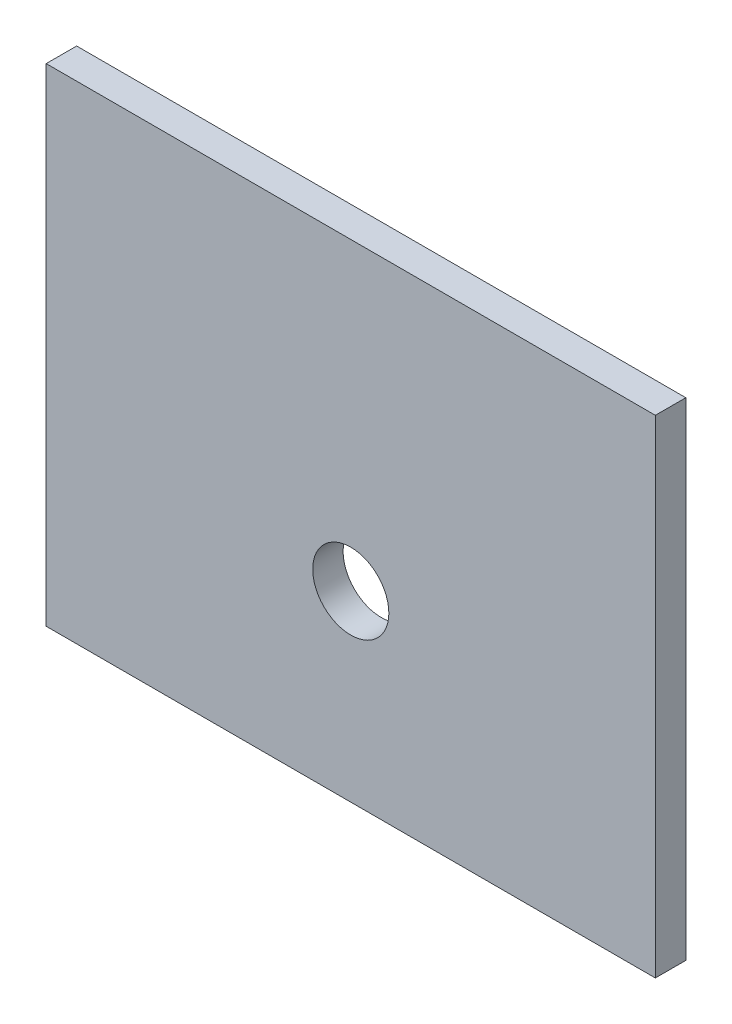
ISO-10303-21;
HEADER;
FILE_DESCRIPTION(('STEP AP214'),'2;1');
FILE_NAME('part.step','',(''),(''),'','','');
FILE_SCHEMA(('AUTOMOTIVE_DESIGN { 1 0 10303 214 1 1 1 1 }'));
ENDSEC;
DATA;
#1=APPLICATION_CONTEXT('core data for automotive mechanical design processes');
#2=APPLICATION_PROTOCOL_DEFINITION('international standard','automotive_design',2000,#1);
#3=PRODUCT_CONTEXT('',#1,'mechanical');
#4=PRODUCT('Part','Part','',(#3));
#5=PRODUCT_RELATED_PRODUCT_CATEGORY('part','',(#4));
#6=PRODUCT_DEFINITION_FORMATION('','',#4);
#7=PRODUCT_DEFINITION_CONTEXT('part definition',#1,'design');
#8=PRODUCT_DEFINITION('design','',#6,#7);
#9=PRODUCT_DEFINITION_SHAPE('','',#8);
#10=(LENGTH_UNIT() NAMED_UNIT(*) SI_UNIT(.MILLI.,.METRE.));
#11=(NAMED_UNIT(*) PLANE_ANGLE_UNIT() SI_UNIT($,.RADIAN.));
#12=(NAMED_UNIT(*) SI_UNIT($,.STERADIAN.) SOLID_ANGLE_UNIT());
#13=UNCERTAINTY_MEASURE_WITH_UNIT(LENGTH_MEASURE(1.E-05),#10,'distance_accuracy_value','');
#14=(GEOMETRIC_REPRESENTATION_CONTEXT(3) GLOBAL_UNCERTAINTY_ASSIGNED_CONTEXT((#13)) GLOBAL_UNIT_ASSIGNED_CONTEXT((#10,
#11,#12)) REPRESENTATION_CONTEXT('',''));
#15=CARTESIAN_POINT('',(0.,0.,0.));
#16=DIRECTION('',(0.,0.,1.));
#17=DIRECTION('',(1.,0.,0.));
#18=AXIS2_PLACEMENT_3D('',#15,#16,#17);
#19=CARTESIAN_POINT('',(0.,0.,3.175));
#20=DIRECTION('',(0.,0.,1.));
#21=DIRECTION('',(1.,0.,0.));
#22=AXIS2_PLACEMENT_3D('',#19,#20,#21);
#23=PLANE('',#22);
#24=DIRECTION('',(0.,1.,0.));
#25=VECTOR('',#24,1.);
#26=CARTESIAN_POINT('',(31.75,25.4,3.175));
#27=LINE('',#26,#25);
#28=CARTESIAN_POINT('',(31.75,-25.4,3.175));
#29=VERTEX_POINT('',#28);
#30=CARTESIAN_POINT('',(31.75,25.4,3.175));
#31=VERTEX_POINT('',#30);
#32=EDGE_CURVE('E84',#29,#31,#27,.T.);
#33=ORIENTED_EDGE('',*,*,#32,.T.);
#34=DIRECTION('',(-1.,0.,0.));
#35=VECTOR('',#34,1.);
#36=CARTESIAN_POINT('',(-31.75,25.4,3.175));
#37=LINE('',#36,#35);
#38=CARTESIAN_POINT('',(-31.75,25.4,3.175));
#39=VERTEX_POINT('',#38);
#40=EDGE_CURVE('E79',#31,#39,#37,.T.);
#41=ORIENTED_EDGE('',*,*,#40,.T.);
#42=DIRECTION('',(0.,-1.,0.));
#43=VECTOR('',#42,1.);
#44=CARTESIAN_POINT('',(-31.75,25.4,3.175));
#45=LINE('',#44,#43);
#46=CARTESIAN_POINT('',(-31.75,-25.4,3.175));
#47=VERTEX_POINT('',#46);
#48=EDGE_CURVE('E82',#39,#47,#45,.T.);
#49=ORIENTED_EDGE('',*,*,#48,.T.);
#50=DIRECTION('',(1.,0.,0.));
#51=VECTOR('',#50,1.);
#52=CARTESIAN_POINT('',(-31.75,-25.4,3.175));
#53=LINE('',#52,#51);
#54=EDGE_CURVE('E49',#47,#29,#53,.T.);
#55=ORIENTED_EDGE('',*,*,#54,.T.);
#56=EDGE_LOOP('',(#33,#41,#49,#55));
#57=FACE_BOUND('',#56,.T.);
#58=CARTESIAN_POINT('',(0.,-6.35,3.175));
#59=DIRECTION('',(0.,0.,1.));
#60=DIRECTION('',(1.,0.,0.));
#61=AXIS2_PLACEMENT_3D('',#58,#59,#60);
#62=CIRCLE('',#61,3.96875);
#63=CARTESIAN_POINT('',(3.96875,-6.35,3.175));
#64=VERTEX_POINT('',#63);
#65=EDGE_CURVE('E99',#64,#64,#62,.T.);
#66=ORIENTED_EDGE('',*,*,#65,.F.);
#67=EDGE_LOOP('',(#66));
#68=FACE_BOUND('',#67,.T.);
#69=ADVANCED_FACE('F32',(#57,#68),#23,.T.);
#70=CARTESIAN_POINT('',(0.,0.,0.));
#71=DIRECTION('',(0.,0.,1.));
#72=DIRECTION('',(1.,0.,0.));
#73=AXIS2_PLACEMENT_3D('',#70,#71,#72);
#74=PLANE('',#73);
#75=DIRECTION('',(0.,1.,0.));
#76=VECTOR('',#75,1.);
#77=CARTESIAN_POINT('',(31.75,25.4,0.));
#78=LINE('',#77,#76);
#79=CARTESIAN_POINT('',(31.75,-25.4,0.));
#80=VERTEX_POINT('',#79);
#81=CARTESIAN_POINT('',(31.75,25.4,0.));
#82=VERTEX_POINT('',#81);
#83=EDGE_CURVE('E96',#80,#82,#78,.T.);
#84=ORIENTED_EDGE('',*,*,#83,.F.);
#85=DIRECTION('',(1.,0.,0.));
#86=VECTOR('',#85,1.);
#87=CARTESIAN_POINT('',(-31.75,-25.4,0.));
#88=LINE('',#87,#86);
#89=CARTESIAN_POINT('',(-31.75,-25.4,0.));
#90=VERTEX_POINT('',#89);
#91=EDGE_CURVE('E72',#90,#80,#88,.T.);
#92=ORIENTED_EDGE('',*,*,#91,.F.);
#93=DIRECTION('',(0.,-1.,0.));
#94=VECTOR('',#93,1.);
#95=CARTESIAN_POINT('',(-31.75,25.4,0.));
#96=LINE('',#95,#94);
#97=CARTESIAN_POINT('',(-31.75,25.4,0.));
#98=VERTEX_POINT('',#97);
#99=EDGE_CURVE('E66',#98,#90,#96,.T.);
#100=ORIENTED_EDGE('',*,*,#99,.F.);
#101=DIRECTION('',(-1.,0.,0.));
#102=VECTOR('',#101,1.);
#103=CARTESIAN_POINT('',(-31.75,25.4,0.));
#104=LINE('',#103,#102);
#105=EDGE_CURVE('E88',#82,#98,#104,.T.);
#106=ORIENTED_EDGE('',*,*,#105,.F.);
#107=EDGE_LOOP('',(#84,#92,#100,#106));
#108=FACE_BOUND('',#107,.T.);
#109=CARTESIAN_POINT('',(0.,-6.35,0.));
#110=DIRECTION('',(0.,0.,1.));
#111=DIRECTION('',(1.,0.,0.));
#112=AXIS2_PLACEMENT_3D('',#109,#110,#111);
#113=CIRCLE('',#112,3.96875);
#114=CARTESIAN_POINT('',(3.96875,-6.35,0.));
#115=VERTEX_POINT('',#114);
#116=EDGE_CURVE('E111',#115,#115,#113,.T.);
#117=ORIENTED_EDGE('',*,*,#116,.T.);
#118=EDGE_LOOP('',(#117));
#119=FACE_BOUND('',#118,.T.);
#120=ADVANCED_FACE('F107',(#108,#119),#74,.F.);
#121=CARTESIAN_POINT('',(31.75,25.4,3.175));
#122=DIRECTION('',(-1.,0.,0.));
#123=DIRECTION('',(0.,0.,1.));
#124=AXIS2_PLACEMENT_3D('',#121,#122,#123);
#125=PLANE('',#124);
#126=ORIENTED_EDGE('',*,*,#83,.T.);
#127=DIRECTION('',(0.,0.,-1.));
#128=VECTOR('',#127,1.);
#129=CARTESIAN_POINT('',(31.75,25.4,3.175));
#130=LINE('',#129,#128);
#131=EDGE_CURVE('E11',#31,#82,#130,.T.);
#132=ORIENTED_EDGE('',*,*,#131,.F.);
#133=ORIENTED_EDGE('',*,*,#32,.F.);
#134=DIRECTION('',(0.,0.,-1.));
#135=VECTOR('',#134,1.);
#136=CARTESIAN_POINT('',(31.75,-25.4,3.175));
#137=LINE('',#136,#135);
#138=EDGE_CURVE('E92',#29,#80,#137,.T.);
#139=ORIENTED_EDGE('',*,*,#138,.T.);
#140=EDGE_LOOP('',(#126,#132,#133,#139));
#141=FACE_BOUND('',#140,.T.);
#142=ADVANCED_FACE('F34',(#141),#125,.F.);
#143=CARTESIAN_POINT('',(-31.75,25.4,3.175));
#144=DIRECTION('',(0.,-1.,0.));
#145=DIRECTION('',(0.,0.,-1.));
#146=AXIS2_PLACEMENT_3D('',#143,#144,#145);
#147=PLANE('',#146);
#148=ORIENTED_EDGE('',*,*,#105,.T.);
#149=DIRECTION('',(0.,0.,-1.));
#150=VECTOR('',#149,1.);
#151=CARTESIAN_POINT('',(-31.75,25.4,3.175));
#152=LINE('',#151,#150);
#153=EDGE_CURVE('E41',#39,#98,#152,.T.);
#154=ORIENTED_EDGE('',*,*,#153,.F.);
#155=ORIENTED_EDGE('',*,*,#40,.F.);
#156=ORIENTED_EDGE('',*,*,#131,.T.);
#157=EDGE_LOOP('',(#148,#154,#155,#156));
#158=FACE_BOUND('',#157,.T.);
#159=ADVANCED_FACE('F87',(#158),#147,.F.);
#160=CARTESIAN_POINT('',(-31.75,25.4,3.175));
#161=DIRECTION('',(1.,0.,0.));
#162=DIRECTION('',(0.,1.,0.));
#163=AXIS2_PLACEMENT_3D('',#160,#161,#162);
#164=PLANE('',#163);
#165=ORIENTED_EDGE('',*,*,#99,.T.);
#166=DIRECTION('',(0.,0.,-1.));
#167=VECTOR('',#166,1.);
#168=CARTESIAN_POINT('',(-31.75,-25.4,3.175));
#169=LINE('',#168,#167);
#170=EDGE_CURVE('E89',#47,#90,#169,.T.);
#171=ORIENTED_EDGE('',*,*,#170,.F.);
#172=ORIENTED_EDGE('',*,*,#48,.F.);
#173=ORIENTED_EDGE('',*,*,#153,.T.);
#174=EDGE_LOOP('',(#165,#171,#172,#173));
#175=FACE_BOUND('',#174,.T.);
#176=ADVANCED_FACE('F90',(#175),#164,.F.);
#177=CARTESIAN_POINT('',(-31.75,-25.4,3.175));
#178=DIRECTION('',(0.,1.,0.));
#179=DIRECTION('',(0.,0.,1.));
#180=AXIS2_PLACEMENT_3D('',#177,#178,#179);
#181=PLANE('',#180);
#182=ORIENTED_EDGE('',*,*,#91,.T.);
#183=ORIENTED_EDGE('',*,*,#138,.F.);
#184=ORIENTED_EDGE('',*,*,#54,.F.);
#185=ORIENTED_EDGE('',*,*,#170,.T.);
#186=EDGE_LOOP('',(#182,#183,#184,#185));
#187=FACE_BOUND('',#186,.T.);
#188=ADVANCED_FACE('F104',(#187),#181,.F.);
#189=CARTESIAN_POINT('',(0.,-6.35,3.175));
#190=DIRECTION('',(0.,0.,-1.));
#191=DIRECTION('',(-1.,0.,0.));
#192=AXIS2_PLACEMENT_3D('',#189,#190,#191);
#193=CYLINDRICAL_SURFACE('',#192,3.96875);
#194=ORIENTED_EDGE('',*,*,#65,.T.);
#195=EDGE_LOOP('',(#194));
#196=FACE_BOUND('',#195,.T.);
#197=ORIENTED_EDGE('',*,*,#116,.F.);
#198=EDGE_LOOP('',(#197));
#199=FACE_BOUND('',#198,.T.);
#200=ADVANCED_FACE('F117',(#196,#199),#193,.F.);
#201=CLOSED_SHELL('',(#69,#120,#142,#159,#176,#188,#200));
#202=MANIFOLD_SOLID_BREP('B2',#201);
#203=ADVANCED_BREP_SHAPE_REPRESENTATION('',(#18,#202),#14);
#204=SHAPE_DEFINITION_REPRESENTATION(#9,#203);
ENDSEC;
END-ISO-10303-21;
